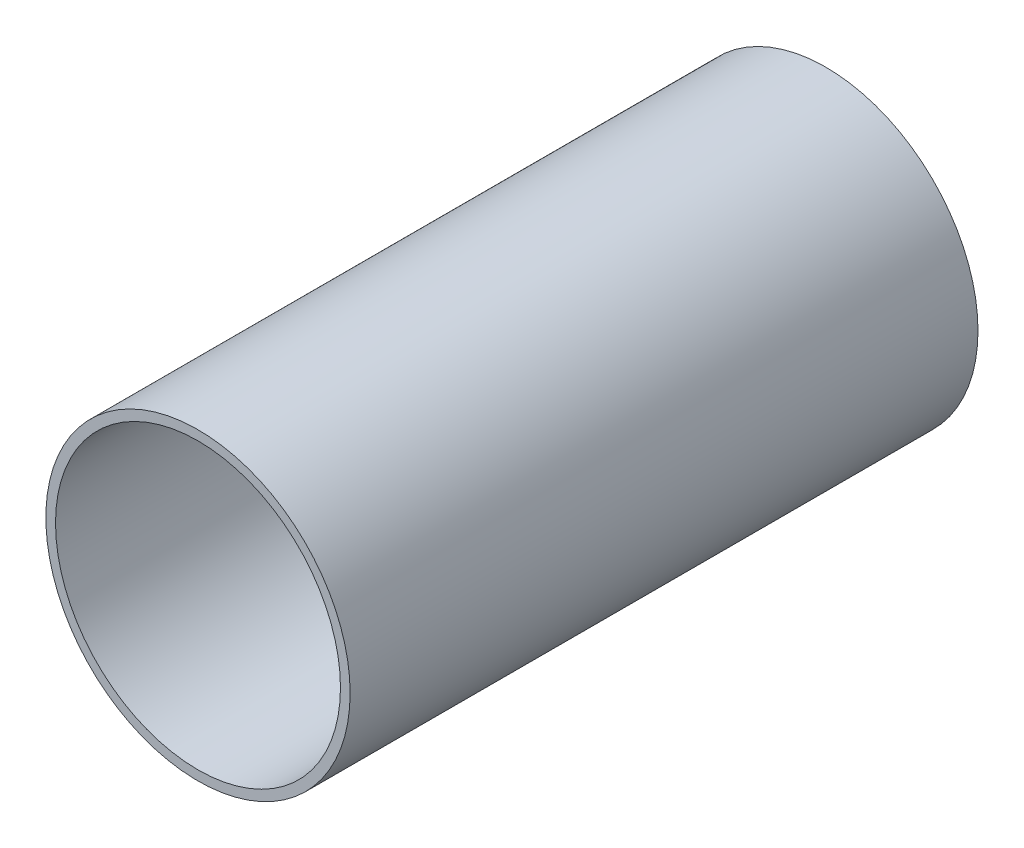
ISO-10303-21;
HEADER;
FILE_DESCRIPTION(('STEP AP214'),'2;1');
FILE_NAME('part.step','',(''),(''),'','','');
FILE_SCHEMA(('AUTOMOTIVE_DESIGN { 1 0 10303 214 1 1 1 1 }'));
ENDSEC;
DATA;
#1=APPLICATION_CONTEXT('core data for automotive mechanical design processes');
#2=APPLICATION_PROTOCOL_DEFINITION('international standard','automotive_design',2000,#1);
#3=PRODUCT_CONTEXT('',#1,'mechanical');
#4=PRODUCT('Part','Part','',(#3));
#5=PRODUCT_RELATED_PRODUCT_CATEGORY('part','',(#4));
#6=PRODUCT_DEFINITION_FORMATION('','',#4);
#7=PRODUCT_DEFINITION_CONTEXT('part definition',#1,'design');
#8=PRODUCT_DEFINITION('design','',#6,#7);
#9=PRODUCT_DEFINITION_SHAPE('','',#8);
#10=(LENGTH_UNIT() NAMED_UNIT(*) SI_UNIT(.MILLI.,.METRE.));
#11=(NAMED_UNIT(*) PLANE_ANGLE_UNIT() SI_UNIT($,.RADIAN.));
#12=(NAMED_UNIT(*) SI_UNIT($,.STERADIAN.) SOLID_ANGLE_UNIT());
#13=UNCERTAINTY_MEASURE_WITH_UNIT(LENGTH_MEASURE(1.E-05),#10,'distance_accuracy_value','');
#14=(GEOMETRIC_REPRESENTATION_CONTEXT(3) GLOBAL_UNCERTAINTY_ASSIGNED_CONTEXT((#13)) GLOBAL_UNIT_ASSIGNED_CONTEXT((#10,
#11,#12)) REPRESENTATION_CONTEXT('',''));
#15=CARTESIAN_POINT('',(0.,0.,0.));
#16=DIRECTION('',(0.,0.,1.));
#17=DIRECTION('',(1.,0.,0.));
#18=AXIS2_PLACEMENT_3D('',#15,#16,#17);
#19=CARTESIAN_POINT('',(0.,0.,130.));
#20=DIRECTION('',(0.,0.,1.));
#21=DIRECTION('',(1.,0.,0.));
#22=AXIS2_PLACEMENT_3D('',#19,#20,#21);
#23=PLANE('',#22);
#24=CARTESIAN_POINT('',(0.,0.,130.));
#25=DIRECTION('',(0.,0.,1.));
#26=DIRECTION('',(1.,0.,0.));
#27=AXIS2_PLACEMENT_3D('',#24,#25,#26);
#28=CIRCLE('',#27,31.5);
#29=CARTESIAN_POINT('',(31.5,0.,130.));
#30=VERTEX_POINT('',#29);
#31=EDGE_CURVE('E10',#30,#30,#28,.T.);
#32=ORIENTED_EDGE('',*,*,#31,.T.);
#33=EDGE_LOOP('',(#32));
#34=FACE_BOUND('',#33,.T.);
#35=CARTESIAN_POINT('',(0.,0.,130.));
#36=DIRECTION('',(0.,0.,1.));
#37=DIRECTION('',(1.,0.,0.));
#38=AXIS2_PLACEMENT_3D('',#35,#36,#37);
#39=CIRCLE('',#38,29.5);
#40=CARTESIAN_POINT('',(29.5,0.,130.));
#41=VERTEX_POINT('',#40);
#42=EDGE_CURVE('E42',#41,#41,#39,.T.);
#43=ORIENTED_EDGE('',*,*,#42,.F.);
#44=EDGE_LOOP('',(#43));
#45=FACE_BOUND('',#44,.T.);
#46=ADVANCED_FACE('F31',(#34,#45),#23,.T.);
#47=CARTESIAN_POINT('',(0.,0.,0.));
#48=DIRECTION('',(0.,0.,1.));
#49=DIRECTION('',(1.,0.,0.));
#50=AXIS2_PLACEMENT_3D('',#47,#48,#49);
#51=PLANE('',#50);
#52=CARTESIAN_POINT('',(0.,0.,0.));
#53=DIRECTION('',(0.,0.,1.));
#54=DIRECTION('',(1.,0.,0.));
#55=AXIS2_PLACEMENT_3D('',#52,#53,#54);
#56=CIRCLE('',#55,31.5);
#57=CARTESIAN_POINT('',(31.5,0.,0.));
#58=VERTEX_POINT('',#57);
#59=EDGE_CURVE('E35',#58,#58,#56,.T.);
#60=ORIENTED_EDGE('',*,*,#59,.F.);
#61=EDGE_LOOP('',(#60));
#62=FACE_BOUND('',#61,.T.);
#63=CARTESIAN_POINT('',(0.,0.,0.));
#64=DIRECTION('',(0.,0.,1.));
#65=DIRECTION('',(1.,0.,0.));
#66=AXIS2_PLACEMENT_3D('',#63,#64,#65);
#67=CIRCLE('',#66,29.5);
#68=CARTESIAN_POINT('',(29.5,0.,0.));
#69=VERTEX_POINT('',#68);
#70=EDGE_CURVE('E44',#69,#69,#67,.T.);
#71=ORIENTED_EDGE('',*,*,#70,.T.);
#72=EDGE_LOOP('',(#71));
#73=FACE_BOUND('',#72,.T.);
#74=ADVANCED_FACE('F54',(#62,#73),#51,.F.);
#75=CARTESIAN_POINT('',(0.,0.,130.));
#76=DIRECTION('',(0.,0.,-1.));
#77=DIRECTION('',(-1.,0.,0.));
#78=AXIS2_PLACEMENT_3D('',#75,#76,#77);
#79=CYLINDRICAL_SURFACE('',#78,31.5);
#80=ORIENTED_EDGE('',*,*,#31,.F.);
#81=EDGE_LOOP('',(#80));
#82=FACE_BOUND('',#81,.T.);
#83=ORIENTED_EDGE('',*,*,#59,.T.);
#84=EDGE_LOOP('',(#83));
#85=FACE_BOUND('',#84,.T.);
#86=ADVANCED_FACE('F33',(#82,#85),#79,.T.);
#87=CARTESIAN_POINT('',(0.,0.,130.));
#88=DIRECTION('',(0.,0.,-1.));
#89=DIRECTION('',(-1.,0.,0.));
#90=AXIS2_PLACEMENT_3D('',#87,#88,#89);
#91=CYLINDRICAL_SURFACE('',#90,29.5);
#92=ORIENTED_EDGE('',*,*,#42,.T.);
#93=EDGE_LOOP('',(#92));
#94=FACE_BOUND('',#93,.T.);
#95=ORIENTED_EDGE('',*,*,#70,.F.);
#96=EDGE_LOOP('',(#95));
#97=FACE_BOUND('',#96,.T.);
#98=ADVANCED_FACE('F50',(#94,#97),#91,.F.);
#99=CLOSED_SHELL('',(#46,#74,#86,#98));
#100=MANIFOLD_SOLID_BREP('B2',#99);
#101=ADVANCED_BREP_SHAPE_REPRESENTATION('',(#18,#100),#14);
#102=SHAPE_DEFINITION_REPRESENTATION(#9,#101);
ENDSEC;
END-ISO-10303-21;
